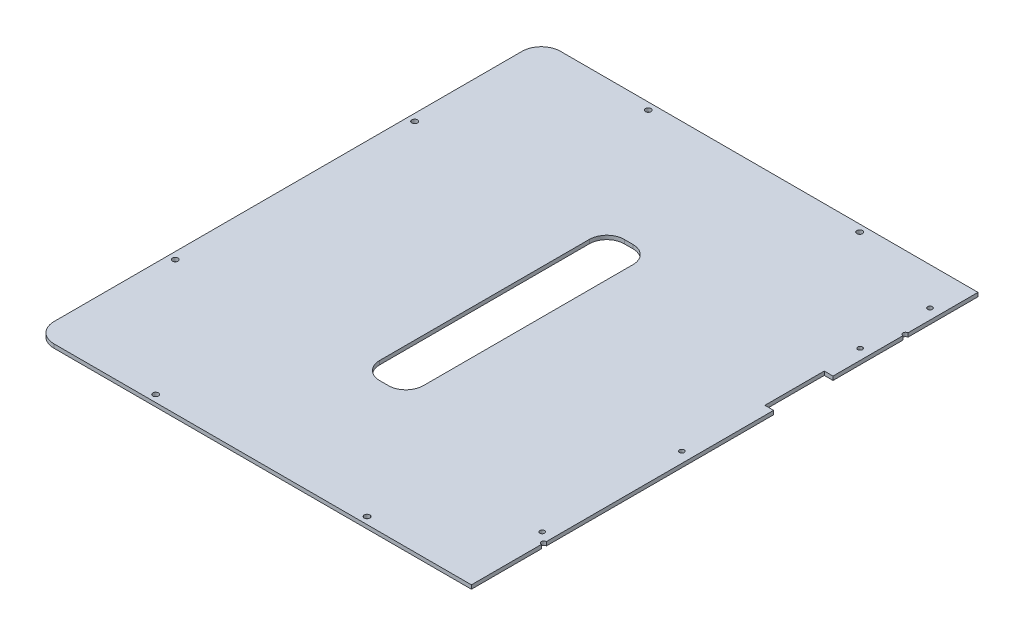
ISO-10303-21;
HEADER;
FILE_DESCRIPTION(('STEP AP214'),'2;1');
FILE_NAME('part.step','',(''),(''),'','','');
FILE_SCHEMA(('AUTOMOTIVE_DESIGN { 1 0 10303 214 1 1 1 1 }'));
ENDSEC;
DATA;
#1=APPLICATION_CONTEXT('core data for automotive mechanical design processes');
#2=APPLICATION_PROTOCOL_DEFINITION('international standard','automotive_design',2000,#1);
#3=PRODUCT_CONTEXT('',#1,'mechanical');
#4=PRODUCT('Part','Part','',(#3));
#5=PRODUCT_RELATED_PRODUCT_CATEGORY('part','',(#4));
#6=PRODUCT_DEFINITION_FORMATION('','',#4);
#7=PRODUCT_DEFINITION_CONTEXT('part definition',#1,'design');
#8=PRODUCT_DEFINITION('design','',#6,#7);
#9=PRODUCT_DEFINITION_SHAPE('','',#8);
#10=(LENGTH_UNIT() NAMED_UNIT(*) SI_UNIT(.MILLI.,.METRE.));
#11=(NAMED_UNIT(*) PLANE_ANGLE_UNIT() SI_UNIT($,.RADIAN.));
#12=(NAMED_UNIT(*) SI_UNIT($,.STERADIAN.) SOLID_ANGLE_UNIT());
#13=UNCERTAINTY_MEASURE_WITH_UNIT(LENGTH_MEASURE(1.E-05),#10,'distance_accuracy_value','');
#14=(GEOMETRIC_REPRESENTATION_CONTEXT(3) GLOBAL_UNCERTAINTY_ASSIGNED_CONTEXT((#13)) GLOBAL_UNIT_ASSIGNED_CONTEXT((#10,
#11,#12)) REPRESENTATION_CONTEXT('',''));
#15=CARTESIAN_POINT('',(0.,0.,0.));
#16=DIRECTION('',(0.,0.,1.));
#17=DIRECTION('',(1.,0.,0.));
#18=AXIS2_PLACEMENT_3D('',#15,#16,#17);
#19=CARTESIAN_POINT('',(-239.,2.2,134.));
#20=DIRECTION('',(0.,1.,0.));
#21=DIRECTION('',(0.,0.,1.));
#22=AXIS2_PLACEMENT_3D('',#19,#20,#21);
#23=PLANE('',#22);
#24=DIRECTION('',(0.,0.,1.));
#25=VECTOR('',#24,1.);
#26=CARTESIAN_POINT('',(1.66533453693773E-13,2.2,-145.));
#27=LINE('',#26,#25);
#28=CARTESIAN_POINT('',(1.66533453693773E-13,2.2,-145.));
#29=VERTEX_POINT('',#28);
#30=CARTESIAN_POINT('',(1.66533453693773E-13,2.2,-104.9));
#31=VERTEX_POINT('',#30);
#32=EDGE_CURVE('E64',#29,#31,#27,.T.);
#33=ORIENTED_EDGE('',*,*,#32,.F.);
#34=DIRECTION('',(-1.,0.,0.));
#35=VECTOR('',#34,1.);
#36=CARTESIAN_POINT('',(-239.,2.2,-145.));
#37=LINE('',#36,#35);
#38=CARTESIAN_POINT('',(-239.,2.2,-145.));
#39=VERTEX_POINT('',#38);
#40=EDGE_CURVE('E199',#29,#39,#37,.T.);
#41=ORIENTED_EDGE('',*,*,#40,.T.);
#42=CARTESIAN_POINT('',(-239.,2.2,-134.));
#43=DIRECTION('',(0.,1.,0.));
#44=DIRECTION('',(0.,0.,1.));
#45=AXIS2_PLACEMENT_3D('',#42,#43,#44);
#46=CIRCLE('',#45,11.);
#47=CARTESIAN_POINT('',(-250.,2.2,-134.));
#48=VERTEX_POINT('',#47);
#49=EDGE_CURVE('E213',#39,#48,#46,.T.);
#50=ORIENTED_EDGE('',*,*,#49,.T.);
#51=DIRECTION('',(0.,0.,1.));
#52=VECTOR('',#51,1.);
#53=CARTESIAN_POINT('',(-250.,2.2,-134.));
#54=LINE('',#53,#52);
#55=CARTESIAN_POINT('',(-250.,2.2,134.));
#56=VERTEX_POINT('',#55);
#57=EDGE_CURVE('E218',#48,#56,#54,.T.);
#58=ORIENTED_EDGE('',*,*,#57,.T.);
#59=CARTESIAN_POINT('',(-239.,2.2,134.));
#60=DIRECTION('',(0.,1.,0.));
#61=DIRECTION('',(0.,0.,1.));
#62=AXIS2_PLACEMENT_3D('',#59,#60,#61);
#63=CIRCLE('',#62,11.);
#64=CARTESIAN_POINT('',(-239.,2.2,145.));
#65=VERTEX_POINT('',#64);
#66=EDGE_CURVE('E221',#56,#65,#63,.T.);
#67=ORIENTED_EDGE('',*,*,#66,.T.);
#68=DIRECTION('',(1.,0.,0.));
#69=VECTOR('',#68,1.);
#70=CARTESIAN_POINT('',(-239.,2.2,145.));
#71=LINE('',#70,#69);
#72=CARTESIAN_POINT('',(1.66533453693773E-13,2.2,145.));
#73=VERTEX_POINT('',#72);
#74=EDGE_CURVE('E214',#65,#73,#71,.T.);
#75=ORIENTED_EDGE('',*,*,#74,.T.);
#76=CARTESIAN_POINT('',(1.66533453693773E-13,2.2,104.9));
#77=VERTEX_POINT('',#76);
#78=EDGE_CURVE('E207',#77,#73,#27,.T.);
#79=ORIENTED_EDGE('',*,*,#78,.F.);
#80=CARTESIAN_POINT('',(0.,2.2,103.5));
#81=DIRECTION('',(0.,1.,0.));
#82=DIRECTION('',(0.,0.,1.));
#83=AXIS2_PLACEMENT_3D('',#80,#81,#82);
#84=CIRCLE('',#83,1.4);
#85=CARTESIAN_POINT('',(1.66533453693773E-13,2.2,102.1));
#86=VERTEX_POINT('',#85);
#87=EDGE_CURVE('E233',#86,#77,#84,.T.);
#88=ORIENTED_EDGE('',*,*,#87,.F.);
#89=CARTESIAN_POINT('',(1.66533453693773E-13,2.2,-28.));
#90=VERTEX_POINT('',#89);
#91=EDGE_CURVE('E497',#90,#86,#27,.T.);
#92=ORIENTED_EDGE('',*,*,#91,.F.);
#93=DIRECTION('',(1.,0.,0.));
#94=VECTOR('',#93,1.);
#95=CARTESIAN_POINT('',(-5.,2.2,-28.));
#96=LINE('',#95,#94);
#97=CARTESIAN_POINT('',(-5.,2.2,-28.));
#98=VERTEX_POINT('',#97);
#99=EDGE_CURVE('E288',#98,#90,#96,.T.);
#100=ORIENTED_EDGE('',*,*,#99,.F.);
#101=DIRECTION('',(0.,0.,1.));
#102=VECTOR('',#101,1.);
#103=CARTESIAN_POINT('',(-5.,2.2,-28.));
#104=LINE('',#103,#102);
#105=CARTESIAN_POINT('',(-5.,2.2,-62.0000000000001));
#106=VERTEX_POINT('',#105);
#107=EDGE_CURVE('E481',#106,#98,#104,.T.);
#108=ORIENTED_EDGE('',*,*,#107,.F.);
#109=DIRECTION('',(-1.,0.,0.));
#110=VECTOR('',#109,1.);
#111=CARTESIAN_POINT('',(-5.,2.2,-62.0000000000001));
#112=LINE('',#111,#110);
#113=CARTESIAN_POINT('',(1.66533453693773E-13,2.2,-62.0000000000001));
#114=VERTEX_POINT('',#113);
#115=EDGE_CURVE('E294',#114,#106,#112,.T.);
#116=ORIENTED_EDGE('',*,*,#115,.F.);
#117=CARTESIAN_POINT('',(1.66533453693773E-13,2.2,-102.1));
#118=VERTEX_POINT('',#117);
#119=EDGE_CURVE('E205',#118,#114,#27,.T.);
#120=ORIENTED_EDGE('',*,*,#119,.F.);
#121=CARTESIAN_POINT('',(0.,2.2,-103.5));
#122=DIRECTION('',(0.,1.,0.));
#123=DIRECTION('',(0.,0.,1.));
#124=AXIS2_PLACEMENT_3D('',#121,#122,#123);
#125=CIRCLE('',#124,1.40000000000001);
#126=EDGE_CURVE('E203',#31,#118,#125,.T.);
#127=ORIENTED_EDGE('',*,*,#126,.F.);
#128=EDGE_LOOP('',(#33,#41,#50,#58,#67,#75,#79,#88,#92,#100,#108,#116,#120,#127));
#129=FACE_BOUND('',#128,.T.);
#130=CARTESIAN_POINT('',(-5.99999999999995,2.2,-123.5));
#131=DIRECTION('',(0.,1.,0.));
#132=DIRECTION('',(0.,0.,1.));
#133=AXIS2_PLACEMENT_3D('',#130,#131,#132);
#134=CIRCLE('',#133,1.35);
#135=CARTESIAN_POINT('',(-5.99999999999995,2.2,-122.15));
#136=VERTEX_POINT('',#135);
#137=EDGE_CURVE('E464',#136,#136,#134,.T.);
#138=ORIENTED_EDGE('',*,*,#137,.F.);
#139=EDGE_LOOP('',(#138));
#140=FACE_BOUND('',#139,.T.);
#141=CARTESIAN_POINT('',(-5.99999999999996,2.2,98.5));
#142=DIRECTION('',(0.,1.,0.));
#143=DIRECTION('',(0.,0.,1.));
#144=AXIS2_PLACEMENT_3D('',#141,#142,#143);
#145=CIRCLE('',#144,1.35);
#146=CARTESIAN_POINT('',(-5.99999999999996,2.2,99.85));
#147=VERTEX_POINT('',#146);
#148=EDGE_CURVE('E473',#147,#147,#145,.T.);
#149=ORIENTED_EDGE('',*,*,#148,.F.);
#150=EDGE_LOOP('',(#149));
#151=FACE_BOUND('',#150,.T.);
#152=CARTESIAN_POINT('',(-5.99999999999995,2.2,-83.5000000000001));
#153=DIRECTION('',(0.,1.,0.));
#154=DIRECTION('',(0.,0.,1.));
#155=AXIS2_PLACEMENT_3D('',#152,#153,#154);
#156=CIRCLE('',#155,1.35);
#157=CARTESIAN_POINT('',(-5.99999999999995,2.2,-82.1500000000001));
#158=VERTEX_POINT('',#157);
#159=EDGE_CURVE('E458',#158,#158,#156,.T.);
#160=ORIENTED_EDGE('',*,*,#159,.F.);
#161=EDGE_LOOP('',(#160));
#162=FACE_BOUND('',#161,.T.);
#163=CARTESIAN_POINT('',(-5.99999999999996,2.2,18.5));
#164=DIRECTION('',(0.,1.,0.));
#165=DIRECTION('',(0.,0.,1.));
#166=AXIS2_PLACEMENT_3D('',#163,#164,#165);
#167=CIRCLE('',#166,1.35);
#168=CARTESIAN_POINT('',(-5.99999999999996,2.2,19.85));
#169=VERTEX_POINT('',#168);
#170=EDGE_CURVE('E263',#169,#169,#167,.T.);
#171=ORIENTED_EDGE('',*,*,#170,.F.);
#172=EDGE_LOOP('',(#171));
#173=FACE_BOUND('',#172,.T.);
#174=CARTESIAN_POINT('',(-184.75,2.2,141.));
#175=DIRECTION('',(0.,1.,0.));
#176=DIRECTION('',(0.,0.,1.));
#177=AXIS2_PLACEMENT_3D('',#174,#175,#176);
#178=CIRCLE('',#177,1.59999999999996);
#179=CARTESIAN_POINT('',(-184.75,2.2,142.6));
#180=VERTEX_POINT('',#179);
#181=EDGE_CURVE('E310',#180,#180,#178,.T.);
#182=ORIENTED_EDGE('',*,*,#181,.F.);
#183=EDGE_LOOP('',(#182));
#184=FACE_BOUND('',#183,.T.);
#185=CARTESIAN_POINT('',(-184.75,2.2,-141.));
#186=DIRECTION('',(0.,1.,0.));
#187=DIRECTION('',(0.,0.,-1.));
#188=AXIS2_PLACEMENT_3D('',#185,#186,#187);
#189=CIRCLE('',#188,1.59999999999996);
#190=CARTESIAN_POINT('',(-184.75,2.2,-142.6));
#191=VERTEX_POINT('',#190);
#192=EDGE_CURVE('E334',#191,#191,#189,.T.);
#193=ORIENTED_EDGE('',*,*,#192,.F.);
#194=EDGE_LOOP('',(#193));
#195=FACE_BOUND('',#194,.T.);
#196=DIRECTION('',(0.,0.,-1.));
#197=VECTOR('',#196,1.);
#198=CARTESIAN_POINT('',(-112.5,2.2,60.));
#199=LINE('',#198,#197);
#200=CARTESIAN_POINT('',(-112.5,2.2,60.));
#201=VERTEX_POINT('',#200);
#202=CARTESIAN_POINT('',(-112.5,2.2,-60.));
#203=VERTEX_POINT('',#202);
#204=EDGE_CURVE('E353',#201,#203,#199,.T.);
#205=ORIENTED_EDGE('',*,*,#204,.F.);
#206=CARTESIAN_POINT('',(-122.5,2.2,60.));
#207=DIRECTION('',(0.,1.,0.));
#208=DIRECTION('',(0.,0.,-1.));
#209=AXIS2_PLACEMENT_3D('',#206,#207,#208);
#210=CIRCLE('',#209,9.99999999999999);
#211=CARTESIAN_POINT('',(-122.5,2.2,70.));
#212=VERTEX_POINT('',#211);
#213=EDGE_CURVE('E350',#212,#201,#210,.T.);
#214=ORIENTED_EDGE('',*,*,#213,.F.);
#215=DIRECTION('',(1.,0.,0.));
#216=VECTOR('',#215,1.);
#217=CARTESIAN_POINT('',(-127.5,2.2,70.));
#218=LINE('',#217,#216);
#219=CARTESIAN_POINT('',(-127.5,2.2,70.));
#220=VERTEX_POINT('',#219);
#221=EDGE_CURVE('E373',#220,#212,#218,.T.);
#222=ORIENTED_EDGE('',*,*,#221,.F.);
#223=CARTESIAN_POINT('',(-127.5,2.2,60.));
#224=DIRECTION('',(0.,1.,0.));
#225=DIRECTION('',(0.,0.,-1.));
#226=AXIS2_PLACEMENT_3D('',#223,#224,#225);
#227=CIRCLE('',#226,9.99999999999999);
#228=CARTESIAN_POINT('',(-137.5,2.2,60.));
#229=VERTEX_POINT('',#228);
#230=EDGE_CURVE('E369',#229,#220,#227,.T.);
#231=ORIENTED_EDGE('',*,*,#230,.F.);
#232=DIRECTION('',(0.,0.,1.));
#233=VECTOR('',#232,1.);
#234=CARTESIAN_POINT('',(-137.5,2.2,60.));
#235=LINE('',#234,#233);
#236=CARTESIAN_POINT('',(-137.5,2.2,-60.));
#237=VERTEX_POINT('',#236);
#238=EDGE_CURVE('E366',#237,#229,#235,.T.);
#239=ORIENTED_EDGE('',*,*,#238,.F.);
#240=CARTESIAN_POINT('',(-127.5,2.2,-60.));
#241=DIRECTION('',(0.,1.,0.));
#242=DIRECTION('',(0.,0.,1.));
#243=AXIS2_PLACEMENT_3D('',#240,#241,#242);
#244=CIRCLE('',#243,9.99999999999999);
#245=CARTESIAN_POINT('',(-127.5,2.2,-70.));
#246=VERTEX_POINT('',#245);
#247=EDGE_CURVE('E363',#246,#237,#244,.T.);
#248=ORIENTED_EDGE('',*,*,#247,.F.);
#249=DIRECTION('',(-1.,0.,0.));
#250=VECTOR('',#249,1.);
#251=CARTESIAN_POINT('',(-127.5,2.2,-70.));
#252=LINE('',#251,#250);
#253=CARTESIAN_POINT('',(-122.5,2.2,-70.));
#254=VERTEX_POINT('',#253);
#255=EDGE_CURVE('E360',#254,#246,#252,.T.);
#256=ORIENTED_EDGE('',*,*,#255,.F.);
#257=CARTESIAN_POINT('',(-122.5,2.2,-60.));
#258=DIRECTION('',(0.,1.,0.));
#259=DIRECTION('',(0.,0.,1.));
#260=AXIS2_PLACEMENT_3D('',#257,#258,#259);
#261=CIRCLE('',#260,9.99999999999999);
#262=EDGE_CURVE('E357',#203,#254,#261,.T.);
#263=ORIENTED_EDGE('',*,*,#262,.F.);
#264=EDGE_LOOP('',(#205,#214,#222,#231,#239,#248,#256,#263));
#265=FACE_BOUND('',#264,.T.);
#266=CARTESIAN_POINT('',(-246.,2.2,-68.5));
#267=DIRECTION('',(0.,1.,0.));
#268=DIRECTION('',(0.,0.,-1.));
#269=AXIS2_PLACEMENT_3D('',#266,#267,#268);
#270=CIRCLE('',#269,1.60000000000002);
#271=CARTESIAN_POINT('',(-246.,2.2,-70.1));
#272=VERTEX_POINT('',#271);
#273=EDGE_CURVE('E342',#272,#272,#270,.T.);
#274=ORIENTED_EDGE('',*,*,#273,.F.);
#275=EDGE_LOOP('',(#274));
#276=FACE_BOUND('',#275,.T.);
#277=CARTESIAN_POINT('',(-63.7499999999997,2.2,-141.));
#278=DIRECTION('',(0.,1.,0.));
#279=DIRECTION('',(0.,0.,-1.));
#280=AXIS2_PLACEMENT_3D('',#277,#278,#279);
#281=CIRCLE('',#280,1.59999999999999);
#282=CARTESIAN_POINT('',(-63.7499999999997,2.2,-142.6));
#283=VERTEX_POINT('',#282);
#284=EDGE_CURVE('E326',#283,#283,#281,.T.);
#285=ORIENTED_EDGE('',*,*,#284,.F.);
#286=EDGE_LOOP('',(#285));
#287=FACE_BOUND('',#286,.T.);
#288=CARTESIAN_POINT('',(-63.7499999999997,2.2,141.));
#289=DIRECTION('',(0.,1.,0.));
#290=DIRECTION('',(0.,0.,1.));
#291=AXIS2_PLACEMENT_3D('',#288,#289,#290);
#292=CIRCLE('',#291,1.59999999999999);
#293=CARTESIAN_POINT('',(-63.7499999999997,2.2,142.6));
#294=VERTEX_POINT('',#293);
#295=EDGE_CURVE('E318',#294,#294,#292,.T.);
#296=ORIENTED_EDGE('',*,*,#295,.F.);
#297=EDGE_LOOP('',(#296));
#298=FACE_BOUND('',#297,.T.);
#299=CARTESIAN_POINT('',(-246.,2.2,68.4999999999999));
#300=DIRECTION('',(0.,1.,0.));
#301=DIRECTION('',(0.,0.,1.));
#302=AXIS2_PLACEMENT_3D('',#299,#300,#301);
#303=CIRCLE('',#302,1.60000000000002);
#304=CARTESIAN_POINT('',(-246.,2.2,70.1));
#305=VERTEX_POINT('',#304);
#306=EDGE_CURVE('E302',#305,#305,#303,.T.);
#307=ORIENTED_EDGE('',*,*,#306,.F.);
#308=EDGE_LOOP('',(#307));
#309=FACE_BOUND('',#308,.T.);
#310=ADVANCED_FACE('F40',(#129,#140,#151,#162,#173,#184,#195,#265,#276,#287,#298,#309),#23,.T.);
#311=CARTESIAN_POINT('',(-239.,0.,134.));
#312=DIRECTION('',(0.,1.,0.));
#313=DIRECTION('',(0.,0.,1.));
#314=AXIS2_PLACEMENT_3D('',#311,#312,#313);
#315=PLANE('',#314);
#316=CARTESIAN_POINT('',(-5.99999999999995,0.,-123.5));
#317=DIRECTION('',(0.,1.,0.));
#318=DIRECTION('',(0.,0.,1.));
#319=AXIS2_PLACEMENT_3D('',#316,#317,#318);
#320=CIRCLE('',#319,1.35);
#321=CARTESIAN_POINT('',(-5.99999999999995,0.,-122.15));
#322=VERTEX_POINT('',#321);
#323=EDGE_CURVE('E270',#322,#322,#320,.T.);
#324=ORIENTED_EDGE('',*,*,#323,.T.);
#325=EDGE_LOOP('',(#324));
#326=FACE_BOUND('',#325,.T.);
#327=CARTESIAN_POINT('',(-5.99999999999996,0.,98.5));
#328=DIRECTION('',(0.,1.,0.));
#329=DIRECTION('',(0.,0.,1.));
#330=AXIS2_PLACEMENT_3D('',#327,#328,#329);
#331=CIRCLE('',#330,1.35);
#332=CARTESIAN_POINT('',(-5.99999999999996,0.,99.85));
#333=VERTEX_POINT('',#332);
#334=EDGE_CURVE('E267',#333,#333,#331,.T.);
#335=ORIENTED_EDGE('',*,*,#334,.T.);
#336=EDGE_LOOP('',(#335));
#337=FACE_BOUND('',#336,.T.);
#338=CARTESIAN_POINT('',(-5.99999999999995,0.,-83.5000000000001));
#339=DIRECTION('',(0.,1.,0.));
#340=DIRECTION('',(0.,0.,1.));
#341=AXIS2_PLACEMENT_3D('',#338,#339,#340);
#342=CIRCLE('',#341,1.35);
#343=CARTESIAN_POINT('',(-5.99999999999995,0.,-82.1500000000001));
#344=VERTEX_POINT('',#343);
#345=EDGE_CURVE('E262',#344,#344,#342,.T.);
#346=ORIENTED_EDGE('',*,*,#345,.T.);
#347=EDGE_LOOP('',(#346));
#348=FACE_BOUND('',#347,.T.);
#349=CARTESIAN_POINT('',(-5.99999999999996,0.,18.5));
#350=DIRECTION('',(0.,1.,0.));
#351=DIRECTION('',(0.,0.,1.));
#352=AXIS2_PLACEMENT_3D('',#349,#350,#351);
#353=CIRCLE('',#352,1.35);
#354=CARTESIAN_POINT('',(-5.99999999999996,0.,19.85));
#355=VERTEX_POINT('',#354);
#356=EDGE_CURVE('E258',#355,#355,#353,.T.);
#357=ORIENTED_EDGE('',*,*,#356,.T.);
#358=EDGE_LOOP('',(#357));
#359=FACE_BOUND('',#358,.T.);
#360=CARTESIAN_POINT('',(-246.,0.,68.4999999999999));
#361=DIRECTION('',(0.,1.,0.));
#362=DIRECTION('',(0.,0.,1.));
#363=AXIS2_PLACEMENT_3D('',#360,#361,#362);
#364=CIRCLE('',#363,1.60000000000002);
#365=CARTESIAN_POINT('',(-246.,0.,70.1));
#366=VERTEX_POINT('',#365);
#367=EDGE_CURVE('E301',#366,#366,#364,.T.);
#368=ORIENTED_EDGE('',*,*,#367,.T.);
#369=EDGE_LOOP('',(#368));
#370=FACE_BOUND('',#369,.T.);
#371=CARTESIAN_POINT('',(-184.75,0.,141.));
#372=DIRECTION('',(0.,1.,0.));
#373=DIRECTION('',(0.,0.,1.));
#374=AXIS2_PLACEMENT_3D('',#371,#372,#373);
#375=CIRCLE('',#374,1.59999999999996);
#376=CARTESIAN_POINT('',(-184.75,0.,142.6));
#377=VERTEX_POINT('',#376);
#378=EDGE_CURVE('E306',#377,#377,#375,.T.);
#379=ORIENTED_EDGE('',*,*,#378,.T.);
#380=EDGE_LOOP('',(#379));
#381=FACE_BOUND('',#380,.T.);
#382=CARTESIAN_POINT('',(-63.7499999999997,0.,141.));
#383=DIRECTION('',(0.,1.,0.));
#384=DIRECTION('',(0.,0.,1.));
#385=AXIS2_PLACEMENT_3D('',#382,#383,#384);
#386=CIRCLE('',#385,1.59999999999999);
#387=CARTESIAN_POINT('',(-63.7499999999997,0.,142.6));
#388=VERTEX_POINT('',#387);
#389=EDGE_CURVE('E314',#388,#388,#386,.T.);
#390=ORIENTED_EDGE('',*,*,#389,.T.);
#391=EDGE_LOOP('',(#390));
#392=FACE_BOUND('',#391,.T.);
#393=CARTESIAN_POINT('',(-63.7499999999997,0.,-141.));
#394=DIRECTION('',(0.,1.,0.));
#395=DIRECTION('',(0.,0.,-1.));
#396=AXIS2_PLACEMENT_3D('',#393,#394,#395);
#397=CIRCLE('',#396,1.59999999999999);
#398=CARTESIAN_POINT('',(-63.7499999999997,0.,-142.6));
#399=VERTEX_POINT('',#398);
#400=EDGE_CURVE('E322',#399,#399,#397,.T.);
#401=ORIENTED_EDGE('',*,*,#400,.T.);
#402=EDGE_LOOP('',(#401));
#403=FACE_BOUND('',#402,.T.);
#404=CARTESIAN_POINT('',(-184.75,0.,-141.));
#405=DIRECTION('',(0.,1.,0.));
#406=DIRECTION('',(0.,0.,-1.));
#407=AXIS2_PLACEMENT_3D('',#404,#405,#406);
#408=CIRCLE('',#407,1.59999999999996);
#409=CARTESIAN_POINT('',(-184.75,0.,-142.6));
#410=VERTEX_POINT('',#409);
#411=EDGE_CURVE('E330',#410,#410,#408,.T.);
#412=ORIENTED_EDGE('',*,*,#411,.T.);
#413=EDGE_LOOP('',(#412));
#414=FACE_BOUND('',#413,.T.);
#415=CARTESIAN_POINT('',(-246.,0.,-68.5));
#416=DIRECTION('',(0.,1.,0.));
#417=DIRECTION('',(0.,0.,-1.));
#418=AXIS2_PLACEMENT_3D('',#415,#416,#417);
#419=CIRCLE('',#418,1.60000000000002);
#420=CARTESIAN_POINT('',(-246.,0.,-70.1));
#421=VERTEX_POINT('',#420);
#422=EDGE_CURVE('E338',#421,#421,#419,.T.);
#423=ORIENTED_EDGE('',*,*,#422,.T.);
#424=EDGE_LOOP('',(#423));
#425=FACE_BOUND('',#424,.T.);
#426=CARTESIAN_POINT('',(-122.5,0.,60.));
#427=DIRECTION('',(0.,1.,0.));
#428=DIRECTION('',(0.,0.,-1.));
#429=AXIS2_PLACEMENT_3D('',#426,#427,#428);
#430=CIRCLE('',#429,9.99999999999999);
#431=CARTESIAN_POINT('',(-122.5,0.,70.));
#432=VERTEX_POINT('',#431);
#433=CARTESIAN_POINT('',(-112.5,0.,60.));
#434=VERTEX_POINT('',#433);
#435=EDGE_CURVE('E346',#432,#434,#430,.T.);
#436=ORIENTED_EDGE('',*,*,#435,.T.);
#437=DIRECTION('',(0.,0.,-1.));
#438=VECTOR('',#437,1.);
#439=CARTESIAN_POINT('',(-112.5,0.,60.));
#440=LINE('',#439,#438);
#441=CARTESIAN_POINT('',(-112.5,0.,-60.));
#442=VERTEX_POINT('',#441);
#443=EDGE_CURVE('E380',#434,#442,#440,.T.);
#444=ORIENTED_EDGE('',*,*,#443,.T.);
#445=CARTESIAN_POINT('',(-122.5,0.,-60.));
#446=DIRECTION('',(0.,1.,0.));
#447=DIRECTION('',(0.,0.,1.));
#448=AXIS2_PLACEMENT_3D('',#445,#446,#447);
#449=CIRCLE('',#448,9.99999999999999);
#450=CARTESIAN_POINT('',(-122.5,0.,-70.));
#451=VERTEX_POINT('',#450);
#452=EDGE_CURVE('E384',#442,#451,#449,.T.);
#453=ORIENTED_EDGE('',*,*,#452,.T.);
#454=DIRECTION('',(-1.,0.,0.));
#455=VECTOR('',#454,1.);
#456=CARTESIAN_POINT('',(-127.5,0.,-70.));
#457=LINE('',#456,#455);
#458=CARTESIAN_POINT('',(-127.5,0.,-70.));
#459=VERTEX_POINT('',#458);
#460=EDGE_CURVE('E388',#451,#459,#457,.T.);
#461=ORIENTED_EDGE('',*,*,#460,.T.);
#462=CARTESIAN_POINT('',(-127.5,0.,-60.));
#463=DIRECTION('',(0.,1.,0.));
#464=DIRECTION('',(0.,0.,1.));
#465=AXIS2_PLACEMENT_3D('',#462,#463,#464);
#466=CIRCLE('',#465,9.99999999999999);
#467=CARTESIAN_POINT('',(-137.5,0.,-60.));
#468=VERTEX_POINT('',#467);
#469=EDGE_CURVE('E392',#459,#468,#466,.T.);
#470=ORIENTED_EDGE('',*,*,#469,.T.);
#471=DIRECTION('',(0.,0.,1.));
#472=VECTOR('',#471,1.);
#473=CARTESIAN_POINT('',(-137.5,0.,60.));
#474=LINE('',#473,#472);
#475=CARTESIAN_POINT('',(-137.5,0.,60.));
#476=VERTEX_POINT('',#475);
#477=EDGE_CURVE('E396',#468,#476,#474,.T.);
#478=ORIENTED_EDGE('',*,*,#477,.T.);
#479=CARTESIAN_POINT('',(-127.5,0.,60.));
#480=DIRECTION('',(0.,1.,0.));
#481=DIRECTION('',(0.,0.,-1.));
#482=AXIS2_PLACEMENT_3D('',#479,#480,#481);
#483=CIRCLE('',#482,9.99999999999999);
#484=CARTESIAN_POINT('',(-127.5,0.,70.));
#485=VERTEX_POINT('',#484);
#486=EDGE_CURVE('E400',#476,#485,#483,.T.);
#487=ORIENTED_EDGE('',*,*,#486,.T.);
#488=DIRECTION('',(1.,0.,0.));
#489=VECTOR('',#488,1.);
#490=CARTESIAN_POINT('',(-127.5,0.,70.));
#491=LINE('',#490,#489);
#492=EDGE_CURVE('E354',#485,#432,#491,.T.);
#493=ORIENTED_EDGE('',*,*,#492,.T.);
#494=EDGE_LOOP('',(#436,#444,#453,#461,#470,#478,#487,#493));
#495=FACE_BOUND('',#494,.T.);
#496=DIRECTION('',(-1.,0.,0.));
#497=VECTOR('',#496,1.);
#498=CARTESIAN_POINT('',(-239.,0.,-145.));
#499=LINE('',#498,#497);
#500=CARTESIAN_POINT('',(1.66533453693773E-13,0.,-145.));
#501=VERTEX_POINT('',#500);
#502=CARTESIAN_POINT('',(-239.,0.,-145.));
#503=VERTEX_POINT('',#502);
#504=EDGE_CURVE('E237',#501,#503,#499,.T.);
#505=ORIENTED_EDGE('',*,*,#504,.F.);
#506=DIRECTION('',(0.,0.,-1.));
#507=VECTOR('',#506,1.);
#508=CARTESIAN_POINT('',(1.66533453693773E-13,0.,-145.));
#509=LINE('',#508,#507);
#510=CARTESIAN_POINT('',(1.66533453693773E-13,0.,-104.9));
#511=VERTEX_POINT('',#510);
#512=EDGE_CURVE('E190',#511,#501,#509,.T.);
#513=ORIENTED_EDGE('',*,*,#512,.F.);
#514=CARTESIAN_POINT('',(0.,0.,-103.5));
#515=DIRECTION('',(0.,1.,0.));
#516=DIRECTION('',(0.,0.,1.));
#517=AXIS2_PLACEMENT_3D('',#514,#515,#516);
#518=CIRCLE('',#517,1.40000000000001);
#519=CARTESIAN_POINT('',(1.66533453693773E-13,0.,-102.1));
#520=VERTEX_POINT('',#519);
#521=EDGE_CURVE('E432',#511,#520,#518,.T.);
#522=ORIENTED_EDGE('',*,*,#521,.T.);
#523=CARTESIAN_POINT('',(1.66533453693773E-13,0.,-62.0000000000001));
#524=VERTEX_POINT('',#523);
#525=EDGE_CURVE('E523',#524,#520,#509,.T.);
#526=ORIENTED_EDGE('',*,*,#525,.F.);
#527=DIRECTION('',(-1.,0.,0.));
#528=VECTOR('',#527,1.);
#529=CARTESIAN_POINT('',(-5.,0.,-62.0000000000001));
#530=LINE('',#529,#528);
#531=CARTESIAN_POINT('',(-5.,0.,-62.0000000000001));
#532=VERTEX_POINT('',#531);
#533=EDGE_CURVE('E273',#524,#532,#530,.T.);
#534=ORIENTED_EDGE('',*,*,#533,.T.);
#535=DIRECTION('',(0.,0.,1.));
#536=VECTOR('',#535,1.);
#537=CARTESIAN_POINT('',(-5.,0.,-28.));
#538=LINE('',#537,#536);
#539=CARTESIAN_POINT('',(-5.,0.,-28.));
#540=VERTEX_POINT('',#539);
#541=EDGE_CURVE('E277',#532,#540,#538,.T.);
#542=ORIENTED_EDGE('',*,*,#541,.T.);
#543=DIRECTION('',(1.,0.,0.));
#544=VECTOR('',#543,1.);
#545=CARTESIAN_POINT('',(-5.,0.,-28.));
#546=LINE('',#545,#544);
#547=CARTESIAN_POINT('',(1.66533453693773E-13,0.,-28.));
#548=VERTEX_POINT('',#547);
#549=EDGE_CURVE('E285',#540,#548,#546,.T.);
#550=ORIENTED_EDGE('',*,*,#549,.T.);
#551=CARTESIAN_POINT('',(1.66533453693773E-13,0.,102.1));
#552=VERTEX_POINT('',#551);
#553=EDGE_CURVE('E520',#552,#548,#509,.T.);
#554=ORIENTED_EDGE('',*,*,#553,.F.);
#555=CARTESIAN_POINT('',(0.,0.,103.5));
#556=DIRECTION('',(0.,1.,0.));
#557=DIRECTION('',(0.,0.,1.));
#558=AXIS2_PLACEMENT_3D('',#555,#556,#557);
#559=CIRCLE('',#558,1.4);
#560=CARTESIAN_POINT('',(1.66533453693774E-13,0.,104.9));
#561=VERTEX_POINT('',#560);
#562=EDGE_CURVE('E435',#552,#561,#559,.T.);
#563=ORIENTED_EDGE('',*,*,#562,.T.);
#564=CARTESIAN_POINT('',(1.66533453693773E-13,0.,145.));
#565=VERTEX_POINT('',#564);
#566=EDGE_CURVE('E56',#565,#561,#509,.T.);
#567=ORIENTED_EDGE('',*,*,#566,.F.);
#568=DIRECTION('',(1.,0.,0.));
#569=VECTOR('',#568,1.);
#570=CARTESIAN_POINT('',(-239.,0.,145.));
#571=LINE('',#570,#569);
#572=CARTESIAN_POINT('',(-239.,0.,145.));
#573=VERTEX_POINT('',#572);
#574=EDGE_CURVE('E232',#573,#565,#571,.T.);
#575=ORIENTED_EDGE('',*,*,#574,.F.);
#576=CARTESIAN_POINT('',(-239.,0.,134.));
#577=DIRECTION('',(0.,1.,0.));
#578=DIRECTION('',(0.,0.,1.));
#579=AXIS2_PLACEMENT_3D('',#576,#577,#578);
#580=CIRCLE('',#579,11.);
#581=CARTESIAN_POINT('',(-250.,0.,134.));
#582=VERTEX_POINT('',#581);
#583=EDGE_CURVE('E228',#582,#573,#580,.T.);
#584=ORIENTED_EDGE('',*,*,#583,.F.);
#585=DIRECTION('',(0.,0.,1.));
#586=VECTOR('',#585,1.);
#587=CARTESIAN_POINT('',(-250.,0.,-134.));
#588=LINE('',#587,#586);
#589=CARTESIAN_POINT('',(-250.,0.,-134.));
#590=VERTEX_POINT('',#589);
#591=EDGE_CURVE('E243',#590,#582,#588,.T.);
#592=ORIENTED_EDGE('',*,*,#591,.F.);
#593=CARTESIAN_POINT('',(-239.,0.,-134.));
#594=DIRECTION('',(0.,1.,0.));
#595=DIRECTION('',(0.,0.,1.));
#596=AXIS2_PLACEMENT_3D('',#593,#594,#595);
#597=CIRCLE('',#596,11.);
#598=EDGE_CURVE('E240',#503,#590,#597,.T.);
#599=ORIENTED_EDGE('',*,*,#598,.F.);
#600=EDGE_LOOP('',(#505,#513,#522,#526,#534,#542,#550,#554,#563,#567,#575,#584,#592,#599));
#601=FACE_BOUND('',#600,.T.);
#602=ADVANCED_FACE('F521',(#326,#337,#348,#359,#370,#381,#392,#403,#414,#425,#495,#601),#315,.F.);
#603=CARTESIAN_POINT('',(-239.,2.2,134.));
#604=DIRECTION('',(0.,-1.,0.));
#605=DIRECTION('',(0.,0.,-1.));
#606=AXIS2_PLACEMENT_3D('',#603,#604,#605);
#607=CYLINDRICAL_SURFACE('',#606,11.);
#608=ORIENTED_EDGE('',*,*,#583,.T.);
#609=DIRECTION('',(0.,-1.,0.));
#610=VECTOR('',#609,1.);
#611=CARTESIAN_POINT('',(-239.,2.2,145.));
#612=LINE('',#611,#610);
#613=EDGE_CURVE('E49',#65,#573,#612,.T.);
#614=ORIENTED_EDGE('',*,*,#613,.F.);
#615=ORIENTED_EDGE('',*,*,#66,.F.);
#616=DIRECTION('',(0.,-1.,0.));
#617=VECTOR('',#616,1.);
#618=CARTESIAN_POINT('',(-250.,2.2,134.));
#619=LINE('',#618,#617);
#620=EDGE_CURVE('E227',#56,#582,#619,.T.);
#621=ORIENTED_EDGE('',*,*,#620,.T.);
#622=EDGE_LOOP('',(#608,#614,#615,#621));
#623=FACE_BOUND('',#622,.T.);
#624=ADVANCED_FACE('F42',(#623),#607,.T.);
#625=CARTESIAN_POINT('',(-239.,2.2,145.));
#626=DIRECTION('',(0.,0.,-1.));
#627=DIRECTION('',(-1.,0.,0.));
#628=AXIS2_PLACEMENT_3D('',#625,#626,#627);
#629=PLANE('',#628);
#630=ORIENTED_EDGE('',*,*,#574,.T.);
#631=DIRECTION('',(0.,1.,0.));
#632=VECTOR('',#631,1.);
#633=CARTESIAN_POINT('',(1.66533453693773E-13,2.2,145.));
#634=LINE('',#633,#632);
#635=EDGE_CURVE('E456',#565,#73,#634,.T.);
#636=ORIENTED_EDGE('',*,*,#635,.T.);
#637=ORIENTED_EDGE('',*,*,#74,.F.);
#638=ORIENTED_EDGE('',*,*,#613,.T.);
#639=EDGE_LOOP('',(#630,#636,#637,#638));
#640=FACE_BOUND('',#639,.T.);
#641=ADVANCED_FACE('F454',(#640),#629,.F.);
#642=CARTESIAN_POINT('',(-239.,2.2,-145.));
#643=DIRECTION('',(0.,0.,1.));
#644=DIRECTION('',(1.,0.,0.));
#645=AXIS2_PLACEMENT_3D('',#642,#643,#644);
#646=PLANE('',#645);
#647=ORIENTED_EDGE('',*,*,#40,.F.);
#648=DIRECTION('',(0.,1.,0.));
#649=VECTOR('',#648,1.);
#650=CARTESIAN_POINT('',(1.66533453693773E-13,-427.310831683064,-145.));
#651=LINE('',#650,#649);
#652=EDGE_CURVE('E187',#501,#29,#651,.T.);
#653=ORIENTED_EDGE('',*,*,#652,.F.);
#654=ORIENTED_EDGE('',*,*,#504,.T.);
#655=DIRECTION('',(0.,-1.,0.));
#656=VECTOR('',#655,1.);
#657=CARTESIAN_POINT('',(-239.,2.2,-145.));
#658=LINE('',#657,#656);
#659=EDGE_CURVE('E210',#39,#503,#658,.T.);
#660=ORIENTED_EDGE('',*,*,#659,.F.);
#661=EDGE_LOOP('',(#647,#653,#654,#660));
#662=FACE_BOUND('',#661,.T.);
#663=ADVANCED_FACE('F208',(#662),#646,.F.);
#664=CARTESIAN_POINT('',(-239.,2.2,-134.));
#665=DIRECTION('',(0.,-1.,0.));
#666=DIRECTION('',(0.,0.,-1.));
#667=AXIS2_PLACEMENT_3D('',#664,#665,#666);
#668=CYLINDRICAL_SURFACE('',#667,11.);
#669=ORIENTED_EDGE('',*,*,#598,.T.);
#670=DIRECTION('',(0.,-1.,0.));
#671=VECTOR('',#670,1.);
#672=CARTESIAN_POINT('',(-250.,2.2,-134.));
#673=LINE('',#672,#671);
#674=EDGE_CURVE('E249',#48,#590,#673,.T.);
#675=ORIENTED_EDGE('',*,*,#674,.F.);
#676=ORIENTED_EDGE('',*,*,#49,.F.);
#677=ORIENTED_EDGE('',*,*,#659,.T.);
#678=EDGE_LOOP('',(#669,#675,#676,#677));
#679=FACE_BOUND('',#678,.T.);
#680=ADVANCED_FACE('F537',(#679),#668,.T.);
#681=CARTESIAN_POINT('',(-250.,2.2,-134.));
#682=DIRECTION('',(1.,0.,0.));
#683=DIRECTION('',(0.,0.,-1.));
#684=AXIS2_PLACEMENT_3D('',#681,#682,#683);
#685=PLANE('',#684);
#686=ORIENTED_EDGE('',*,*,#591,.T.);
#687=ORIENTED_EDGE('',*,*,#620,.F.);
#688=ORIENTED_EDGE('',*,*,#57,.F.);
#689=ORIENTED_EDGE('',*,*,#674,.T.);
#690=EDGE_LOOP('',(#686,#687,#688,#689));
#691=FACE_BOUND('',#690,.T.);
#692=ADVANCED_FACE('F540',(#691),#685,.F.);
#693=CARTESIAN_POINT('',(0.,2.2,103.5));
#694=DIRECTION('',(0.,-1.,0.));
#695=DIRECTION('',(0.,0.,-1.));
#696=AXIS2_PLACEMENT_3D('',#693,#694,#695);
#697=CYLINDRICAL_SURFACE('',#696,1.4);
#698=DIRECTION('',(0.,-1.,0.));
#699=VECTOR('',#698,1.);
#700=CARTESIAN_POINT('',(1.66533453693773E-13,2.2,102.1));
#701=LINE('',#700,#699);
#702=EDGE_CURVE('E459',#86,#552,#701,.T.);
#703=ORIENTED_EDGE('',*,*,#702,.F.);
#704=ORIENTED_EDGE('',*,*,#87,.T.);
#705=DIRECTION('',(0.,-1.,0.));
#706=VECTOR('',#705,1.);
#707=CARTESIAN_POINT('',(1.66533453693773E-13,2.2,104.9));
#708=LINE('',#707,#706);
#709=EDGE_CURVE('E466',#561,#77,#708,.F.);
#710=ORIENTED_EDGE('',*,*,#709,.F.);
#711=ORIENTED_EDGE('',*,*,#562,.F.);
#712=EDGE_LOOP('',(#703,#704,#710,#711));
#713=FACE_BOUND('',#712,.T.);
#714=ADVANCED_FACE('F517',(#713),#697,.F.);
#715=CARTESIAN_POINT('',(0.,2.2,-103.5));
#716=DIRECTION('',(0.,-1.,0.));
#717=DIRECTION('',(0.,0.,-1.));
#718=AXIS2_PLACEMENT_3D('',#715,#716,#717);
#719=CYLINDRICAL_SURFACE('',#718,1.40000000000001);
#720=DIRECTION('',(0.,-1.,0.));
#721=VECTOR('',#720,1.);
#722=CARTESIAN_POINT('',(1.66533453693773E-13,2.2,-104.9));
#723=LINE('',#722,#721);
#724=EDGE_CURVE('E511',#31,#511,#723,.T.);
#725=ORIENTED_EDGE('',*,*,#724,.F.);
#726=ORIENTED_EDGE('',*,*,#126,.T.);
#727=DIRECTION('',(0.,-1.,0.));
#728=VECTOR('',#727,1.);
#729=CARTESIAN_POINT('',(1.66533453693773E-13,2.2,-102.1));
#730=LINE('',#729,#728);
#731=EDGE_CURVE('E508',#520,#118,#730,.F.);
#732=ORIENTED_EDGE('',*,*,#731,.F.);
#733=ORIENTED_EDGE('',*,*,#521,.F.);
#734=EDGE_LOOP('',(#725,#726,#732,#733));
#735=FACE_BOUND('',#734,.T.);
#736=ADVANCED_FACE('F533',(#735),#719,.F.);
#737=CARTESIAN_POINT('',(-122.5,2.2,60.));
#738=DIRECTION('',(0.,-1.,0.));
#739=DIRECTION('',(0.,0.,-1.));
#740=AXIS2_PLACEMENT_3D('',#737,#738,#739);
#741=CYLINDRICAL_SURFACE('',#740,9.99999999999999);
#742=ORIENTED_EDGE('',*,*,#435,.F.);
#743=DIRECTION('',(0.,-1.,0.));
#744=VECTOR('',#743,1.);
#745=CARTESIAN_POINT('',(-122.5,2.2,70.));
#746=LINE('',#745,#744);
#747=EDGE_CURVE('E376',#212,#432,#746,.T.);
#748=ORIENTED_EDGE('',*,*,#747,.F.);
#749=ORIENTED_EDGE('',*,*,#213,.T.);
#750=DIRECTION('',(0.,-1.,0.));
#751=VECTOR('',#750,1.);
#752=CARTESIAN_POINT('',(-112.5,2.2,60.));
#753=LINE('',#752,#751);
#754=EDGE_CURVE('E428',#201,#434,#753,.T.);
#755=ORIENTED_EDGE('',*,*,#754,.T.);
#756=EDGE_LOOP('',(#742,#748,#749,#755));
#757=FACE_BOUND('',#756,.T.);
#758=ADVANCED_FACE('F560',(#757),#741,.F.);
#759=CARTESIAN_POINT('',(-112.5,2.2,60.));
#760=DIRECTION('',(-1.,0.,0.));
#761=DIRECTION('',(0.,0.,1.));
#762=AXIS2_PLACEMENT_3D('',#759,#760,#761);
#763=PLANE('',#762);
#764=ORIENTED_EDGE('',*,*,#443,.F.);
#765=ORIENTED_EDGE('',*,*,#754,.F.);
#766=ORIENTED_EDGE('',*,*,#204,.T.);
#767=DIRECTION('',(0.,-1.,0.));
#768=VECTOR('',#767,1.);
#769=CARTESIAN_POINT('',(-112.5,2.2,-60.));
#770=LINE('',#769,#768);
#771=EDGE_CURVE('E425',#203,#442,#770,.T.);
#772=ORIENTED_EDGE('',*,*,#771,.T.);
#773=EDGE_LOOP('',(#764,#765,#766,#772));
#774=FACE_BOUND('',#773,.T.);
#775=ADVANCED_FACE('F563',(#774),#763,.T.);
#776=CARTESIAN_POINT('',(-122.5,2.2,-60.));
#777=DIRECTION('',(0.,-1.,0.));
#778=DIRECTION('',(0.,0.,-1.));
#779=AXIS2_PLACEMENT_3D('',#776,#777,#778);
#780=CYLINDRICAL_SURFACE('',#779,9.99999999999999);
#781=ORIENTED_EDGE('',*,*,#452,.F.);
#782=ORIENTED_EDGE('',*,*,#771,.F.);
#783=ORIENTED_EDGE('',*,*,#262,.T.);
#784=DIRECTION('',(0.,-1.,0.));
#785=VECTOR('',#784,1.);
#786=CARTESIAN_POINT('',(-122.5,2.2,-70.));
#787=LINE('',#786,#785);
#788=EDGE_CURVE('E422',#254,#451,#787,.T.);
#789=ORIENTED_EDGE('',*,*,#788,.T.);
#790=EDGE_LOOP('',(#781,#782,#783,#789));
#791=FACE_BOUND('',#790,.T.);
#792=ADVANCED_FACE('F567',(#791),#780,.F.);
#793=CARTESIAN_POINT('',(-127.5,2.2,-70.));
#794=DIRECTION('',(0.,0.,1.));
#795=DIRECTION('',(1.,0.,0.));
#796=AXIS2_PLACEMENT_3D('',#793,#794,#795);
#797=PLANE('',#796);
#798=ORIENTED_EDGE('',*,*,#460,.F.);
#799=ORIENTED_EDGE('',*,*,#788,.F.);
#800=ORIENTED_EDGE('',*,*,#255,.T.);
#801=DIRECTION('',(0.,-1.,0.));
#802=VECTOR('',#801,1.);
#803=CARTESIAN_POINT('',(-127.5,2.2,-70.));
#804=LINE('',#803,#802);
#805=EDGE_CURVE('E419',#246,#459,#804,.T.);
#806=ORIENTED_EDGE('',*,*,#805,.T.);
#807=EDGE_LOOP('',(#798,#799,#800,#806));
#808=FACE_BOUND('',#807,.T.);
#809=ADVANCED_FACE('F571',(#808),#797,.T.);
#810=CARTESIAN_POINT('',(-127.5,2.2,-60.));
#811=DIRECTION('',(0.,-1.,0.));
#812=DIRECTION('',(0.,0.,-1.));
#813=AXIS2_PLACEMENT_3D('',#810,#811,#812);
#814=CYLINDRICAL_SURFACE('',#813,9.99999999999999);
#815=ORIENTED_EDGE('',*,*,#469,.F.);
#816=ORIENTED_EDGE('',*,*,#805,.F.);
#817=ORIENTED_EDGE('',*,*,#247,.T.);
#818=DIRECTION('',(0.,-1.,0.));
#819=VECTOR('',#818,1.);
#820=CARTESIAN_POINT('',(-137.5,2.2,-60.));
#821=LINE('',#820,#819);
#822=EDGE_CURVE('E416',#237,#468,#821,.T.);
#823=ORIENTED_EDGE('',*,*,#822,.T.);
#824=EDGE_LOOP('',(#815,#816,#817,#823));
#825=FACE_BOUND('',#824,.T.);
#826=ADVANCED_FACE('F575',(#825),#814,.F.);
#827=CARTESIAN_POINT('',(-137.5,2.2,60.));
#828=DIRECTION('',(1.,0.,0.));
#829=DIRECTION('',(0.,0.,-1.));
#830=AXIS2_PLACEMENT_3D('',#827,#828,#829);
#831=PLANE('',#830);
#832=ORIENTED_EDGE('',*,*,#477,.F.);
#833=ORIENTED_EDGE('',*,*,#822,.F.);
#834=ORIENTED_EDGE('',*,*,#238,.T.);
#835=DIRECTION('',(0.,-1.,0.));
#836=VECTOR('',#835,1.);
#837=CARTESIAN_POINT('',(-137.5,2.2,60.));
#838=LINE('',#837,#836);
#839=EDGE_CURVE('E413',#229,#476,#838,.T.);
#840=ORIENTED_EDGE('',*,*,#839,.T.);
#841=EDGE_LOOP('',(#832,#833,#834,#840));
#842=FACE_BOUND('',#841,.T.);
#843=ADVANCED_FACE('F579',(#842),#831,.T.);
#844=CARTESIAN_POINT('',(-127.5,2.2,60.));
#845=DIRECTION('',(0.,-1.,0.));
#846=DIRECTION('',(0.,0.,-1.));
#847=AXIS2_PLACEMENT_3D('',#844,#845,#846);
#848=CYLINDRICAL_SURFACE('',#847,9.99999999999999);
#849=ORIENTED_EDGE('',*,*,#486,.F.);
#850=ORIENTED_EDGE('',*,*,#839,.F.);
#851=ORIENTED_EDGE('',*,*,#230,.T.);
#852=DIRECTION('',(0.,-1.,0.));
#853=VECTOR('',#852,1.);
#854=CARTESIAN_POINT('',(-127.5,2.2,70.));
#855=LINE('',#854,#853);
#856=EDGE_CURVE('E410',#220,#485,#855,.T.);
#857=ORIENTED_EDGE('',*,*,#856,.T.);
#858=EDGE_LOOP('',(#849,#850,#851,#857));
#859=FACE_BOUND('',#858,.T.);
#860=ADVANCED_FACE('F583',(#859),#848,.F.);
#861=CARTESIAN_POINT('',(-127.5,2.2,70.));
#862=DIRECTION('',(0.,0.,-1.));
#863=DIRECTION('',(-1.,0.,0.));
#864=AXIS2_PLACEMENT_3D('',#861,#862,#863);
#865=PLANE('',#864);
#866=ORIENTED_EDGE('',*,*,#492,.F.);
#867=ORIENTED_EDGE('',*,*,#856,.F.);
#868=ORIENTED_EDGE('',*,*,#221,.T.);
#869=ORIENTED_EDGE('',*,*,#747,.T.);
#870=EDGE_LOOP('',(#866,#867,#868,#869));
#871=FACE_BOUND('',#870,.T.);
#872=ADVANCED_FACE('F587',(#871),#865,.T.);
#873=CARTESIAN_POINT('',(-246.,2.2,-68.5));
#874=DIRECTION('',(0.,-1.,0.));
#875=DIRECTION('',(0.,0.,-1.));
#876=AXIS2_PLACEMENT_3D('',#873,#874,#875);
#877=CYLINDRICAL_SURFACE('',#876,1.60000000000002);
#878=ORIENTED_EDGE('',*,*,#273,.T.);
#879=EDGE_LOOP('',(#878));
#880=FACE_BOUND('',#879,.T.);
#881=ORIENTED_EDGE('',*,*,#422,.F.);
#882=EDGE_LOOP('',(#881));
#883=FACE_BOUND('',#882,.T.);
#884=ADVANCED_FACE('F591',(#880,#883),#877,.F.);
#885=CARTESIAN_POINT('',(-184.75,2.2,-141.));
#886=DIRECTION('',(0.,-1.,0.));
#887=DIRECTION('',(0.,0.,-1.));
#888=AXIS2_PLACEMENT_3D('',#885,#886,#887);
#889=CYLINDRICAL_SURFACE('',#888,1.59999999999996);
#890=ORIENTED_EDGE('',*,*,#192,.T.);
#891=EDGE_LOOP('',(#890));
#892=FACE_BOUND('',#891,.T.);
#893=ORIENTED_EDGE('',*,*,#411,.F.);
#894=EDGE_LOOP('',(#893));
#895=FACE_BOUND('',#894,.T.);
#896=ADVANCED_FACE('F595',(#892,#895),#889,.F.);
#897=CARTESIAN_POINT('',(-63.7499999999997,2.2,-141.));
#898=DIRECTION('',(0.,-1.,0.));
#899=DIRECTION('',(0.,0.,-1.));
#900=AXIS2_PLACEMENT_3D('',#897,#898,#899);
#901=CYLINDRICAL_SURFACE('',#900,1.59999999999999);
#902=ORIENTED_EDGE('',*,*,#284,.T.);
#903=EDGE_LOOP('',(#902));
#904=FACE_BOUND('',#903,.T.);
#905=ORIENTED_EDGE('',*,*,#400,.F.);
#906=EDGE_LOOP('',(#905));
#907=FACE_BOUND('',#906,.T.);
#908=ADVANCED_FACE('F599',(#904,#907),#901,.F.);
#909=CARTESIAN_POINT('',(-63.7499999999997,2.2,141.));
#910=DIRECTION('',(0.,-1.,0.));
#911=DIRECTION('',(0.,0.,-1.));
#912=AXIS2_PLACEMENT_3D('',#909,#910,#911);
#913=CYLINDRICAL_SURFACE('',#912,1.59999999999999);
#914=ORIENTED_EDGE('',*,*,#295,.T.);
#915=EDGE_LOOP('',(#914));
#916=FACE_BOUND('',#915,.T.);
#917=ORIENTED_EDGE('',*,*,#389,.F.);
#918=EDGE_LOOP('',(#917));
#919=FACE_BOUND('',#918,.T.);
#920=ADVANCED_FACE('F603',(#916,#919),#913,.F.);
#921=CARTESIAN_POINT('',(-184.75,2.2,141.));
#922=DIRECTION('',(0.,-1.,0.));
#923=DIRECTION('',(0.,0.,-1.));
#924=AXIS2_PLACEMENT_3D('',#921,#922,#923);
#925=CYLINDRICAL_SURFACE('',#924,1.59999999999996);
#926=ORIENTED_EDGE('',*,*,#181,.T.);
#927=EDGE_LOOP('',(#926));
#928=FACE_BOUND('',#927,.T.);
#929=ORIENTED_EDGE('',*,*,#378,.F.);
#930=EDGE_LOOP('',(#929));
#931=FACE_BOUND('',#930,.T.);
#932=ADVANCED_FACE('F607',(#928,#931),#925,.F.);
#933=CARTESIAN_POINT('',(-246.,2.2,68.4999999999999));
#934=DIRECTION('',(0.,-1.,0.));
#935=DIRECTION('',(0.,0.,-1.));
#936=AXIS2_PLACEMENT_3D('',#933,#934,#935);
#937=CYLINDRICAL_SURFACE('',#936,1.60000000000002);
#938=ORIENTED_EDGE('',*,*,#306,.T.);
#939=EDGE_LOOP('',(#938));
#940=FACE_BOUND('',#939,.T.);
#941=ORIENTED_EDGE('',*,*,#367,.F.);
#942=EDGE_LOOP('',(#941));
#943=FACE_BOUND('',#942,.T.);
#944=ADVANCED_FACE('F611',(#940,#943),#937,.F.);
#945=CARTESIAN_POINT('',(-5.,2.2,-62.0000000000001));
#946=DIRECTION('',(0.,0.,1.));
#947=DIRECTION('',(1.,0.,0.));
#948=AXIS2_PLACEMENT_3D('',#945,#946,#947);
#949=PLANE('',#948);
#950=DIRECTION('',(0.,-1.,0.));
#951=VECTOR('',#950,1.);
#952=CARTESIAN_POINT('',(1.66533453693773E-13,2.2,-62.0000000000001));
#953=LINE('',#952,#951);
#954=EDGE_CURVE('E505',#114,#524,#953,.T.);
#955=ORIENTED_EDGE('',*,*,#954,.F.);
#956=ORIENTED_EDGE('',*,*,#115,.T.);
#957=DIRECTION('',(0.,-1.,0.));
#958=VECTOR('',#957,1.);
#959=CARTESIAN_POINT('',(-5.,2.2,-62.0000000000001));
#960=LINE('',#959,#958);
#961=EDGE_CURVE('E298',#106,#532,#960,.T.);
#962=ORIENTED_EDGE('',*,*,#961,.T.);
#963=ORIENTED_EDGE('',*,*,#533,.F.);
#964=EDGE_LOOP('',(#955,#956,#962,#963));
#965=FACE_BOUND('',#964,.T.);
#966=ADVANCED_FACE('F615',(#965),#949,.T.);
#967=CARTESIAN_POINT('',(-5.,2.2,-28.));
#968=DIRECTION('',(1.,0.,0.));
#969=DIRECTION('',(0.,0.,-1.));
#970=AXIS2_PLACEMENT_3D('',#967,#968,#969);
#971=PLANE('',#970);
#972=ORIENTED_EDGE('',*,*,#541,.F.);
#973=ORIENTED_EDGE('',*,*,#961,.F.);
#974=ORIENTED_EDGE('',*,*,#107,.T.);
#975=DIRECTION('',(0.,-1.,0.));
#976=VECTOR('',#975,1.);
#977=CARTESIAN_POINT('',(-5.,2.2,-28.));
#978=LINE('',#977,#976);
#979=EDGE_CURVE('E295',#98,#540,#978,.T.);
#980=ORIENTED_EDGE('',*,*,#979,.T.);
#981=EDGE_LOOP('',(#972,#973,#974,#980));
#982=FACE_BOUND('',#981,.T.);
#983=ADVANCED_FACE('F619',(#982),#971,.T.);
#984=CARTESIAN_POINT('',(-5.,2.2,-28.));
#985=DIRECTION('',(0.,0.,-1.));
#986=DIRECTION('',(-1.,0.,0.));
#987=AXIS2_PLACEMENT_3D('',#984,#985,#986);
#988=PLANE('',#987);
#989=DIRECTION('',(0.,1.,0.));
#990=VECTOR('',#989,1.);
#991=CARTESIAN_POINT('',(1.66533453693773E-13,2.2,-28.));
#992=LINE('',#991,#990);
#993=EDGE_CURVE('E11',#548,#90,#992,.T.);
#994=ORIENTED_EDGE('',*,*,#993,.F.);
#995=ORIENTED_EDGE('',*,*,#549,.F.);
#996=ORIENTED_EDGE('',*,*,#979,.F.);
#997=ORIENTED_EDGE('',*,*,#99,.T.);
#998=EDGE_LOOP('',(#994,#995,#996,#997));
#999=FACE_BOUND('',#998,.T.);
#1000=ADVANCED_FACE('F492',(#999),#988,.T.);
#1001=CARTESIAN_POINT('',(-5.99999999999996,-57.,18.5));
#1002=DIRECTION('',(0.,1.,0.));
#1003=DIRECTION('',(0.,0.,1.));
#1004=AXIS2_PLACEMENT_3D('',#1001,#1002,#1003);
#1005=CYLINDRICAL_SURFACE('',#1004,1.35);
#1006=ORIENTED_EDGE('',*,*,#170,.T.);
#1007=EDGE_LOOP('',(#1006));
#1008=FACE_BOUND('',#1007,.T.);
#1009=ORIENTED_EDGE('',*,*,#356,.F.);
#1010=EDGE_LOOP('',(#1009));
#1011=FACE_BOUND('',#1010,.T.);
#1012=ADVANCED_FACE('F625',(#1008,#1011),#1005,.F.);
#1013=CARTESIAN_POINT('',(-5.99999999999995,-57.,-83.5000000000001));
#1014=DIRECTION('',(0.,1.,0.));
#1015=DIRECTION('',(0.,0.,1.));
#1016=AXIS2_PLACEMENT_3D('',#1013,#1014,#1015);
#1017=CYLINDRICAL_SURFACE('',#1016,1.35);
#1018=ORIENTED_EDGE('',*,*,#159,.T.);
#1019=EDGE_LOOP('',(#1018));
#1020=FACE_BOUND('',#1019,.T.);
#1021=ORIENTED_EDGE('',*,*,#345,.F.);
#1022=EDGE_LOOP('',(#1021));
#1023=FACE_BOUND('',#1022,.T.);
#1024=ADVANCED_FACE('F628',(#1020,#1023),#1017,.F.);
#1025=CARTESIAN_POINT('',(-5.99999999999996,-57.,98.5));
#1026=DIRECTION('',(0.,1.,0.));
#1027=DIRECTION('',(0.,0.,1.));
#1028=AXIS2_PLACEMENT_3D('',#1025,#1026,#1027);
#1029=CYLINDRICAL_SURFACE('',#1028,1.35);
#1030=ORIENTED_EDGE('',*,*,#148,.T.);
#1031=EDGE_LOOP('',(#1030));
#1032=FACE_BOUND('',#1031,.T.);
#1033=ORIENTED_EDGE('',*,*,#334,.F.);
#1034=EDGE_LOOP('',(#1033));
#1035=FACE_BOUND('',#1034,.T.);
#1036=ADVANCED_FACE('F630',(#1032,#1035),#1029,.F.);
#1037=CARTESIAN_POINT('',(-5.99999999999995,-57.,-123.5));
#1038=DIRECTION('',(0.,1.,0.));
#1039=DIRECTION('',(0.,0.,1.));
#1040=AXIS2_PLACEMENT_3D('',#1037,#1038,#1039);
#1041=CYLINDRICAL_SURFACE('',#1040,1.35);
#1042=ORIENTED_EDGE('',*,*,#137,.T.);
#1043=EDGE_LOOP('',(#1042));
#1044=FACE_BOUND('',#1043,.T.);
#1045=ORIENTED_EDGE('',*,*,#323,.F.);
#1046=EDGE_LOOP('',(#1045));
#1047=FACE_BOUND('',#1046,.T.);
#1048=ADVANCED_FACE('F633',(#1044,#1047),#1041,.F.);
#1049=CARTESIAN_POINT('',(1.66533453693773E-13,-427.310831683064,-145.));
#1050=DIRECTION('',(-1.,0.,0.));
#1051=DIRECTION('',(0.,0.,1.));
#1052=AXIS2_PLACEMENT_3D('',#1049,#1050,#1051);
#1053=PLANE('',#1052);
#1054=ORIENTED_EDGE('',*,*,#702,.T.);
#1055=ORIENTED_EDGE('',*,*,#553,.T.);
#1056=ORIENTED_EDGE('',*,*,#993,.T.);
#1057=ORIENTED_EDGE('',*,*,#91,.T.);
#1058=EDGE_LOOP('',(#1054,#1055,#1056,#1057));
#1059=FACE_BOUND('',#1058,.T.);
#1060=ADVANCED_FACE('F519',(#1059),#1053,.F.);
#1061=ORIENTED_EDGE('',*,*,#731,.T.);
#1062=ORIENTED_EDGE('',*,*,#119,.T.);
#1063=ORIENTED_EDGE('',*,*,#954,.T.);
#1064=ORIENTED_EDGE('',*,*,#525,.T.);
#1065=EDGE_LOOP('',(#1061,#1062,#1063,#1064));
#1066=FACE_BOUND('',#1065,.T.);
#1067=ADVANCED_FACE('F529',(#1066),#1053,.F.);
#1068=ORIENTED_EDGE('',*,*,#724,.T.);
#1069=ORIENTED_EDGE('',*,*,#512,.T.);
#1070=ORIENTED_EDGE('',*,*,#652,.T.);
#1071=ORIENTED_EDGE('',*,*,#32,.T.);
#1072=EDGE_LOOP('',(#1068,#1069,#1070,#1071));
#1073=FACE_BOUND('',#1072,.T.);
#1074=ADVANCED_FACE('F188',(#1073),#1053,.F.);
#1075=ORIENTED_EDGE('',*,*,#566,.T.);
#1076=ORIENTED_EDGE('',*,*,#709,.T.);
#1077=ORIENTED_EDGE('',*,*,#78,.T.);
#1078=ORIENTED_EDGE('',*,*,#635,.F.);
#1079=EDGE_LOOP('',(#1075,#1076,#1077,#1078));
#1080=FACE_BOUND('',#1079,.T.);
#1081=ADVANCED_FACE('F514',(#1080),#1053,.F.);
#1082=CLOSED_SHELL('',(#310,#602,#624,#641,#663,#680,#692,#714,#736,#758,#775,#792,#809,#826,
#843,#860,#872,#884,#896,#908,#920,#932,#944,#966,#983,#1000,#1012,#1024,#1036,#1048,#1060,
#1067,#1074,#1081));
#1083=MANIFOLD_SOLID_BREP('B2',#1082);
#1084=ADVANCED_BREP_SHAPE_REPRESENTATION('',(#18,#1083),#14);
#1085=SHAPE_DEFINITION_REPRESENTATION(#9,#1084);
ENDSEC;
END-ISO-10303-21;
